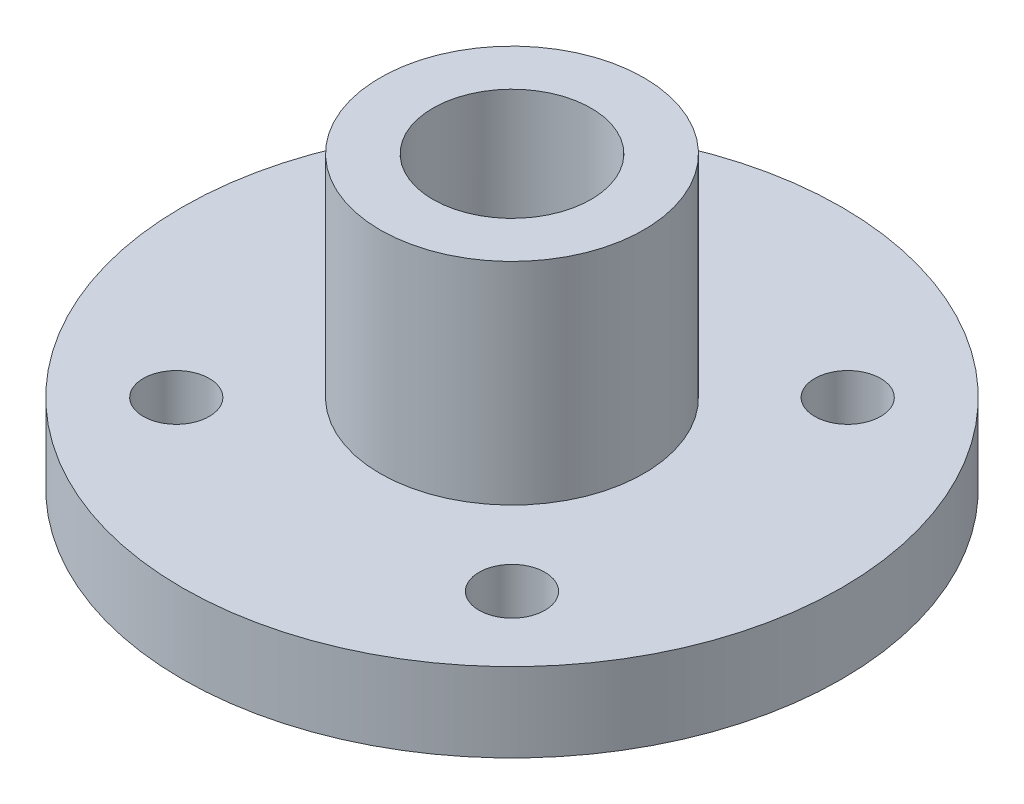
ISO-10303-21;
HEADER;
FILE_DESCRIPTION(('STEP AP214'),'2;1');
FILE_NAME('part.step','',(''),(''),'','','');
FILE_SCHEMA(('AUTOMOTIVE_DESIGN { 1 0 10303 214 1 1 1 1 }'));
ENDSEC;
DATA;
#1=APPLICATION_CONTEXT('core data for automotive mechanical design processes');
#2=APPLICATION_PROTOCOL_DEFINITION('international standard','automotive_design',2000,#1);
#3=PRODUCT_CONTEXT('',#1,'mechanical');
#4=PRODUCT('Part','Part','',(#3));
#5=PRODUCT_RELATED_PRODUCT_CATEGORY('part','',(#4));
#6=PRODUCT_DEFINITION_FORMATION('','',#4);
#7=PRODUCT_DEFINITION_CONTEXT('part definition',#1,'design');
#8=PRODUCT_DEFINITION('design','',#6,#7);
#9=PRODUCT_DEFINITION_SHAPE('','',#8);
#10=(LENGTH_UNIT() NAMED_UNIT(*) SI_UNIT(.MILLI.,.METRE.));
#11=(NAMED_UNIT(*) PLANE_ANGLE_UNIT() SI_UNIT($,.RADIAN.));
#12=(NAMED_UNIT(*) SI_UNIT($,.STERADIAN.) SOLID_ANGLE_UNIT());
#13=UNCERTAINTY_MEASURE_WITH_UNIT(LENGTH_MEASURE(1.E-05),#10,'distance_accuracy_value','');
#14=(GEOMETRIC_REPRESENTATION_CONTEXT(3) GLOBAL_UNCERTAINTY_ASSIGNED_CONTEXT((#13)) GLOBAL_UNIT_ASSIGNED_CONTEXT((#10,
#11,#12)) REPRESENTATION_CONTEXT('',''));
#15=CARTESIAN_POINT('',(0.,0.,0.));
#16=DIRECTION('',(0.,0.,1.));
#17=DIRECTION('',(1.,0.,0.));
#18=AXIS2_PLACEMENT_3D('',#15,#16,#17);
#19=CARTESIAN_POINT('',(-6.36396103067894,3.,-6.36396103067892));
#20=DIRECTION('',(0.,-1.,0.));
#21=DIRECTION('',(0.,0.,-1.));
#22=AXIS2_PLACEMENT_3D('',#19,#20,#21);
#23=CYLINDRICAL_SURFACE('',#22,1.25);
#24=CARTESIAN_POINT('',(-6.36396103067894,3.,-6.36396103067892));
#25=DIRECTION('',(0.,1.,0.));
#26=DIRECTION('',(0.,0.,1.));
#27=AXIS2_PLACEMENT_3D('',#24,#25,#26);
#28=CIRCLE('',#27,1.25);
#29=CARTESIAN_POINT('',(-6.36396103067894,3.,-5.11396103067892));
#30=VERTEX_POINT('',#29);
#31=EDGE_CURVE('E71',#30,#30,#28,.T.);
#32=ORIENTED_EDGE('',*,*,#31,.T.);
#33=EDGE_LOOP('',(#32));
#34=FACE_BOUND('',#33,.T.);
#35=CARTESIAN_POINT('',(-6.36396103067894,0.,-6.36396103067892));
#36=DIRECTION('',(0.,1.,0.));
#37=DIRECTION('',(0.,0.,1.));
#38=AXIS2_PLACEMENT_3D('',#35,#36,#37);
#39=CIRCLE('',#38,1.25);
#40=CARTESIAN_POINT('',(-6.36396103067894,0.,-5.11396103067892));
#41=VERTEX_POINT('',#40);
#42=EDGE_CURVE('E102',#41,#41,#39,.T.);
#43=ORIENTED_EDGE('',*,*,#42,.F.);
#44=EDGE_LOOP('',(#43));
#45=FACE_BOUND('',#44,.T.);
#46=ADVANCED_FACE('F51',(#34,#45),#23,.F.);
#47=CARTESIAN_POINT('',(6.36396103067894,3.,-6.36396103067891));
#48=DIRECTION('',(0.,-1.,0.));
#49=DIRECTION('',(0.,0.,-1.));
#50=AXIS2_PLACEMENT_3D('',#47,#48,#49);
#51=CYLINDRICAL_SURFACE('',#50,1.25);
#52=CARTESIAN_POINT('',(6.36396103067894,3.,-6.36396103067891));
#53=DIRECTION('',(0.,1.,0.));
#54=DIRECTION('',(0.,0.,1.));
#55=AXIS2_PLACEMENT_3D('',#52,#53,#54);
#56=CIRCLE('',#55,1.25);
#57=CARTESIAN_POINT('',(6.36396103067894,3.,-5.11396103067891));
#58=VERTEX_POINT('',#57);
#59=EDGE_CURVE('E87',#58,#58,#56,.T.);
#60=ORIENTED_EDGE('',*,*,#59,.T.);
#61=EDGE_LOOP('',(#60));
#62=FACE_BOUND('',#61,.T.);
#63=CARTESIAN_POINT('',(6.36396103067894,0.,-6.36396103067891));
#64=DIRECTION('',(0.,1.,0.));
#65=DIRECTION('',(0.,0.,1.));
#66=AXIS2_PLACEMENT_3D('',#63,#64,#65);
#67=CIRCLE('',#66,1.25);
#68=CARTESIAN_POINT('',(6.36396103067894,0.,-5.11396103067891));
#69=VERTEX_POINT('',#68);
#70=EDGE_CURVE('E103',#69,#69,#67,.T.);
#71=ORIENTED_EDGE('',*,*,#70,.F.);
#72=EDGE_LOOP('',(#71));
#73=FACE_BOUND('',#72,.T.);
#74=ADVANCED_FACE('F131',(#62,#73),#51,.F.);
#75=CARTESIAN_POINT('',(6.36396103067893,3.,6.36396103067897));
#76=DIRECTION('',(0.,-1.,0.));
#77=DIRECTION('',(0.,0.,-1.));
#78=AXIS2_PLACEMENT_3D('',#75,#76,#77);
#79=CYLINDRICAL_SURFACE('',#78,1.25);
#80=CARTESIAN_POINT('',(6.36396103067893,3.,6.36396103067897));
#81=DIRECTION('',(0.,1.,0.));
#82=DIRECTION('',(0.,0.,1.));
#83=AXIS2_PLACEMENT_3D('',#80,#81,#82);
#84=CIRCLE('',#83,1.25);
#85=CARTESIAN_POINT('',(6.36396103067893,3.,7.61396103067897));
#86=VERTEX_POINT('',#85);
#87=EDGE_CURVE('E84',#86,#86,#84,.T.);
#88=ORIENTED_EDGE('',*,*,#87,.T.);
#89=EDGE_LOOP('',(#88));
#90=FACE_BOUND('',#89,.T.);
#91=CARTESIAN_POINT('',(6.36396103067893,0.,6.36396103067897));
#92=DIRECTION('',(0.,1.,0.));
#93=DIRECTION('',(0.,0.,1.));
#94=AXIS2_PLACEMENT_3D('',#91,#92,#93);
#95=CIRCLE('',#94,1.25);
#96=CARTESIAN_POINT('',(6.36396103067893,0.,7.61396103067897));
#97=VERTEX_POINT('',#96);
#98=EDGE_CURVE('E97',#97,#97,#95,.T.);
#99=ORIENTED_EDGE('',*,*,#98,.F.);
#100=EDGE_LOOP('',(#99));
#101=FACE_BOUND('',#100,.T.);
#102=ADVANCED_FACE('F139',(#90,#101),#79,.F.);
#103=CARTESIAN_POINT('',(-6.36396103067894,3.,6.36396103067897));
#104=DIRECTION('',(0.,-1.,0.));
#105=DIRECTION('',(0.,0.,-1.));
#106=AXIS2_PLACEMENT_3D('',#103,#104,#105);
#107=CYLINDRICAL_SURFACE('',#106,1.25);
#108=CARTESIAN_POINT('',(-6.36396103067894,3.,6.36396103067897));
#109=DIRECTION('',(0.,1.,0.));
#110=DIRECTION('',(0.,0.,1.));
#111=AXIS2_PLACEMENT_3D('',#108,#109,#110);
#112=CIRCLE('',#111,1.25);
#113=CARTESIAN_POINT('',(-6.36396103067894,3.,7.61396103067897));
#114=VERTEX_POINT('',#113);
#115=EDGE_CURVE('E80',#114,#114,#112,.T.);
#116=ORIENTED_EDGE('',*,*,#115,.T.);
#117=EDGE_LOOP('',(#116));
#118=FACE_BOUND('',#117,.T.);
#119=CARTESIAN_POINT('',(-6.36396103067894,0.,6.36396103067897));
#120=DIRECTION('',(0.,1.,0.));
#121=DIRECTION('',(0.,0.,1.));
#122=AXIS2_PLACEMENT_3D('',#119,#120,#121);
#123=CIRCLE('',#122,1.25);
#124=CARTESIAN_POINT('',(-6.36396103067894,0.,7.61396103067897));
#125=VERTEX_POINT('',#124);
#126=EDGE_CURVE('E92',#125,#125,#123,.T.);
#127=ORIENTED_EDGE('',*,*,#126,.F.);
#128=EDGE_LOOP('',(#127));
#129=FACE_BOUND('',#128,.T.);
#130=ADVANCED_FACE('F52',(#118,#129),#107,.F.);
#131=CARTESIAN_POINT('',(0.,3.,0.));
#132=DIRECTION('',(0.,-1.,0.));
#133=DIRECTION('',(0.,0.,-1.));
#134=AXIS2_PLACEMENT_3D('',#131,#132,#133);
#135=CYLINDRICAL_SURFACE('',#134,12.5);
#136=CARTESIAN_POINT('',(0.,3.,0.));
#137=DIRECTION('',(0.,1.,0.));
#138=DIRECTION('',(0.,0.,1.));
#139=AXIS2_PLACEMENT_3D('',#136,#137,#138);
#140=CIRCLE('',#139,12.5);
#141=CARTESIAN_POINT('',(0.,3.,12.5));
#142=VERTEX_POINT('',#141);
#143=EDGE_CURVE('E62',#142,#142,#140,.T.);
#144=ORIENTED_EDGE('',*,*,#143,.F.);
#145=EDGE_LOOP('',(#144));
#146=FACE_BOUND('',#145,.T.);
#147=CARTESIAN_POINT('',(0.,0.,0.));
#148=DIRECTION('',(0.,1.,0.));
#149=DIRECTION('',(0.,0.,1.));
#150=AXIS2_PLACEMENT_3D('',#147,#148,#149);
#151=CIRCLE('',#150,12.5);
#152=CARTESIAN_POINT('',(0.,0.,12.5));
#153=VERTEX_POINT('',#152);
#154=EDGE_CURVE('E81',#153,#153,#151,.T.);
#155=ORIENTED_EDGE('',*,*,#154,.T.);
#156=EDGE_LOOP('',(#155));
#157=FACE_BOUND('',#156,.T.);
#158=ADVANCED_FACE('F115',(#146,#157),#135,.T.);
#159=CARTESIAN_POINT('',(0.,3.,0.));
#160=DIRECTION('',(0.,1.,0.));
#161=DIRECTION('',(0.,0.,1.));
#162=AXIS2_PLACEMENT_3D('',#159,#160,#161);
#163=PLANE('',#162);
#164=CARTESIAN_POINT('',(0.,3.,0.));
#165=DIRECTION('',(0.,1.,0.));
#166=DIRECTION('',(0.,0.,1.));
#167=AXIS2_PLACEMENT_3D('',#164,#165,#166);
#168=CIRCLE('',#167,5.);
#169=CARTESIAN_POINT('',(0.,3.,5.));
#170=VERTEX_POINT('',#169);
#171=EDGE_CURVE('E11',#170,#170,#168,.T.);
#172=ORIENTED_EDGE('',*,*,#171,.F.);
#173=EDGE_LOOP('',(#172));
#174=FACE_BOUND('',#173,.T.);
#175=ORIENTED_EDGE('',*,*,#115,.F.);
#176=EDGE_LOOP('',(#175));
#177=FACE_BOUND('',#176,.T.);
#178=ORIENTED_EDGE('',*,*,#87,.F.);
#179=EDGE_LOOP('',(#178));
#180=FACE_BOUND('',#179,.T.);
#181=ORIENTED_EDGE('',*,*,#59,.F.);
#182=EDGE_LOOP('',(#181));
#183=FACE_BOUND('',#182,.T.);
#184=ORIENTED_EDGE('',*,*,#31,.F.);
#185=EDGE_LOOP('',(#184));
#186=FACE_BOUND('',#185,.T.);
#187=ORIENTED_EDGE('',*,*,#143,.T.);
#188=EDGE_LOOP('',(#187));
#189=FACE_BOUND('',#188,.T.);
#190=ADVANCED_FACE('F120',(#174,#177,#180,#183,#186,#189),#163,.T.);
#191=CARTESIAN_POINT('',(0.,0.,0.));
#192=DIRECTION('',(0.,1.,0.));
#193=DIRECTION('',(0.,0.,1.));
#194=AXIS2_PLACEMENT_3D('',#191,#192,#193);
#195=PLANE('',#194);
#196=ORIENTED_EDGE('',*,*,#126,.T.);
#197=EDGE_LOOP('',(#196));
#198=FACE_BOUND('',#197,.T.);
#199=ORIENTED_EDGE('',*,*,#98,.T.);
#200=EDGE_LOOP('',(#199));
#201=FACE_BOUND('',#200,.T.);
#202=ORIENTED_EDGE('',*,*,#70,.T.);
#203=EDGE_LOOP('',(#202));
#204=FACE_BOUND('',#203,.T.);
#205=ORIENTED_EDGE('',*,*,#42,.T.);
#206=EDGE_LOOP('',(#205));
#207=FACE_BOUND('',#206,.T.);
#208=ORIENTED_EDGE('',*,*,#154,.F.);
#209=EDGE_LOOP('',(#208));
#210=FACE_BOUND('',#209,.T.);
#211=ADVANCED_FACE('F112',(#198,#201,#204,#207,#210),#195,.F.);
#212=CARTESIAN_POINT('',(0.,11.,0.));
#213=DIRECTION('',(0.,1.,0.));
#214=DIRECTION('',(0.,0.,1.));
#215=AXIS2_PLACEMENT_3D('',#212,#213,#214);
#216=PLANE('',#215);
#217=CARTESIAN_POINT('',(0.,11.,0.));
#218=DIRECTION('',(0.,1.,0.));
#219=DIRECTION('',(0.,0.,1.));
#220=AXIS2_PLACEMENT_3D('',#217,#218,#219);
#221=CIRCLE('',#220,5.);
#222=CARTESIAN_POINT('',(0.,11.,5.));
#223=VERTEX_POINT('',#222);
#224=EDGE_CURVE('E74',#223,#223,#221,.T.);
#225=ORIENTED_EDGE('',*,*,#224,.T.);
#226=EDGE_LOOP('',(#225));
#227=FACE_BOUND('',#226,.T.);
#228=CARTESIAN_POINT('',(0.,11.,0.));
#229=DIRECTION('',(0.,1.,0.));
#230=DIRECTION('',(0.,0.,1.));
#231=AXIS2_PLACEMENT_3D('',#228,#229,#230);
#232=CIRCLE('',#231,3.);
#233=CARTESIAN_POINT('',(0.,11.,3.));
#234=VERTEX_POINT('',#233);
#235=EDGE_CURVE('E253',#234,#234,#232,.T.);
#236=ORIENTED_EDGE('',*,*,#235,.F.);
#237=EDGE_LOOP('',(#236));
#238=FACE_BOUND('',#237,.T.);
#239=ADVANCED_FACE('F116',(#227,#238),#216,.T.);
#240=CARTESIAN_POINT('',(0.,11.,0.));
#241=DIRECTION('',(0.,-1.,0.));
#242=DIRECTION('',(0.,0.,-1.));
#243=AXIS2_PLACEMENT_3D('',#240,#241,#242);
#244=CYLINDRICAL_SURFACE('',#243,5.);
#245=CARTESIAN_POINT('',(-4.76969600708473,6.,-1.5));
#246=CARTESIAN_POINT('',(-4.7696968572698,6.0821945479424,-1.49999897633764));
#247=CARTESIAN_POINT('',(-4.77184390209069,6.16439922414402,-1.49322108167142));
#248=CARTESIAN_POINT('',(-4.780165783029,6.32640524959194,-1.46635844446749));
#249=CARTESIAN_POINT('',(-4.78634196493468,6.40620578650146,-1.44626925573578));
#250=CARTESIAN_POINT('',(-4.80196102485633,6.56103472827173,-1.39352753269955));
#251=CARTESIAN_POINT('',(-4.81139846703232,6.63607082963309,-1.36089589394243));
#252=CARTESIAN_POINT('',(-4.83246932547567,6.7796219339953,-1.28406421917929));
#253=CARTESIAN_POINT('',(-4.84410307041019,6.84813595868444,-1.23986245137053));
#254=CARTESIAN_POINT('',(-4.86866862185765,6.97886639057737,-1.13964754141627));
#255=CARTESIAN_POINT('',(-4.88162808311636,7.04084589794629,-1.08333207175807));
#256=CARTESIAN_POINT('',(-4.90714861936757,7.15463795132251,-0.961136237579599));
#257=CARTESIAN_POINT('',(-4.91970964297705,7.20644919044988,-0.895254645461111));
#258=CARTESIAN_POINT('',(-4.94333214579389,7.29946269983331,-0.75411143779369));
#259=CARTESIAN_POINT('',(-4.95435724342404,7.34042342444281,-0.678684021335814));
#260=CARTESIAN_POINT('',(-4.97334435920684,7.40898725904276,-0.521624645369353));
#261=CARTESIAN_POINT('',(-4.98130703789495,7.43659324985745,-0.439994028387911));
#262=CARTESIAN_POINT('',(-4.99307646003589,7.47688000109051,-0.275323852630829));
#263=CARTESIAN_POINT('',(-4.99699557369338,7.4899651276527,-0.1923913989538));
#264=CARTESIAN_POINT('',(-5.00063201501348,7.50211732464644,-0.0254218237493144));
#265=CARTESIAN_POINT('',(-5.00035022521079,7.50118733940196,0.0586150620503689));
#266=CARTESIAN_POINT('',(-4.99569603817659,7.48560713145698,0.222571156600161));
#267=CARTESIAN_POINT('',(-4.9914542020526,7.47139480619013,0.302536267641342));
#268=CARTESIAN_POINT('',(-4.97951522112593,7.43036866400571,0.458889213442527));
#269=CARTESIAN_POINT('',(-4.97181785750586,7.40355404905733,0.535276821322847));
#270=CARTESIAN_POINT('',(-4.95365220986963,7.33778797658144,0.683347326351281));
#271=CARTESIAN_POINT('',(-4.94315269676706,7.29869879719273,0.754965064694478));
#272=CARTESIAN_POINT('',(-4.92049640648069,7.20960214757177,0.890764673783156));
#273=CARTESIAN_POINT('',(-4.90833923637778,7.15959208703651,0.954944774872131));
#274=CARTESIAN_POINT('',(-4.88311550488165,7.0478022492484,1.0766604815298));
#275=CARTESIAN_POINT('',(-4.87003195321461,6.98564308097026,1.13384458040111));
#276=CARTESIAN_POINT('',(-4.84483979887497,6.85248998210995,1.23707651539824));
#277=CARTESIAN_POINT('',(-4.8327312931702,6.78149517461077,1.28312324482853));
#278=CARTESIAN_POINT('',(-4.81077903197678,6.63176053075101,1.3631399533545));
#279=CARTESIAN_POINT('',(-4.80095810695957,6.55295295413708,1.39698989237679));
#280=CARTESIAN_POINT('',(-4.78496392548436,6.39039279155446,1.45083362878413));
#281=CARTESIAN_POINT('',(-4.7787894791583,6.30664182846544,1.4708319464056));
#282=CARTESIAN_POINT('',(-4.77104849541241,6.13991763926072,1.49574770282165));
#283=CARTESIAN_POINT('',(-4.7693187867044,6.05703177610602,1.50119946380212));
#284=CARTESIAN_POINT('',(-4.77021192441924,5.89152709999013,1.49835947233062));
#285=CARTESIAN_POINT('',(-4.77283416156589,5.80890825126915,1.4900696437133));
#286=CARTESIAN_POINT('',(-4.78197558554912,5.64851162202913,1.4604576357419));
#287=CARTESIAN_POINT('',(-4.78839176507489,5.57066383573648,1.4394796143128));
#288=CARTESIAN_POINT('',(-4.80429141231227,5.41959830918508,1.3854857774794));
#289=CARTESIAN_POINT('',(-4.81377535359073,5.34638128585943,1.3524681034276));
#290=CARTESIAN_POINT('',(-4.83505835023047,5.20448253592787,1.274318711965));
#291=CARTESIAN_POINT('',(-4.84691271069799,5.13597527901421,1.22888564172729));
#292=CARTESIAN_POINT('',(-4.87148205646987,5.0073618938192,1.12755301600385));
#293=CARTESIAN_POINT('',(-4.88419724730003,4.94725778238721,1.07165095534897));
#294=CARTESIAN_POINT('',(-4.90963633548158,4.83481959418526,0.948455132493599));
#295=CARTESIAN_POINT('',(-4.92234245063004,4.78286437101302,0.880811065857434));
#296=CARTESIAN_POINT('',(-4.94584851748651,4.69103329897225,0.737461784590249));
#297=CARTESIAN_POINT('',(-4.95664856384717,4.65115685021854,0.661756970543944));
#298=CARTESIAN_POINT('',(-4.97505970474957,4.5849999694317,0.504935504705221));
#299=CARTESIAN_POINT('',(-4.98269453424966,4.55861798384102,0.423864622037839));
#300=CARTESIAN_POINT('',(-4.99401979596827,4.51993908110958,0.258169966504588));
#301=CARTESIAN_POINT('',(-4.9977113567088,4.50763813405158,0.173547217354763));
#302=CARTESIAN_POINT('',(-5.00066544081399,4.4977769559455,0.00665215388274276));
#303=CARTESIAN_POINT('',(-5.00009305111322,4.49966730459217,-0.0755851790862067));
#304=CARTESIAN_POINT('',(-4.99497264465037,4.51682163249912,-0.238519481164404));
#305=CARTESIAN_POINT('',(-4.99042485330463,4.53208485348044,-0.319216537346529));
#306=CARTESIAN_POINT('',(-4.97791168358327,4.57521166139962,-0.475935813041358));
#307=CARTESIAN_POINT('',(-4.96998352900866,4.60293818064901,-0.551998927351392));
#308=CARTESIAN_POINT('',(-4.9515294303945,4.67008191450719,-0.698433237752053));
#309=CARTESIAN_POINT('',(-4.94100305949946,4.70950105028619,-0.76880349605058));
#310=CARTESIAN_POINT('',(-4.91803965828228,4.80037345743003,-0.904301892420563));
#311=CARTESIAN_POINT('',(-4.90555226923559,4.85217143000077,-0.969190250076767));
#312=CARTESIAN_POINT('',(-4.88023537212334,4.9657103883328,-1.08953757134594));
#313=CARTESIAN_POINT('',(-4.86740576641079,5.02745423789815,-1.14499380960194));
#314=CARTESIAN_POINT('',(-4.84240680631319,5.16134077831051,-1.24656269394549));
#315=CARTESIAN_POINT('',(-4.83026852693485,5.23373855339044,-1.29234759757956));
#316=CARTESIAN_POINT('',(-4.80852547508793,5.38555517416102,-1.37104313528776));
#317=CARTESIAN_POINT('',(-4.79891948596955,5.4649706236012,-1.40395995557289));
#318=CARTESIAN_POINT('',(-4.78427816717595,5.61974043160627,-1.4530194253295));
#319=CARTESIAN_POINT('',(-4.7788615484052,5.69460864693099,-1.47058859011232));
#320=CARTESIAN_POINT('',(-4.77157042597167,5.84631522249577,-1.49407818835144));
#321=CARTESIAN_POINT('',(-4.7696952122143,5.92315318464525,-1.50000095706095));
#322=CARTESIAN_POINT('',(-4.76969600708473,6.,-1.5));
#323=B_SPLINE_CURVE_WITH_KNOTS('',3,(#245,#246,#247,#248,#249,#250,#251,#252,#253,#254,#255,
#256,#257,#258,#259,#260,#261,#262,#263,#264,#265,#266,#267,#268,#269,#270,#271,#272,#273,#274,
#275,#276,#277,#278,#279,#280,#281,#282,#283,#284,#285,#286,#287,#288,#289,#290,#291,#292,#293,
#294,#295,#296,#297,#298,#299,#300,#301,#302,#303,#304,#305,#306,#307,#308,#309,#310,#311,#312,
#313,#314,#315,#316,#317,#318,#319,#320,#321,#322),.UNSPECIFIED.,.T.,.F.,(4,2,2,2,2,2,2,2,2,2,2,
2,2,2,2,2,2,2,2,2,2,2,2,2,2,2,2,2,2,2,2,2,2,2,2,2,2,2,4),(0.,0.246300165915543,0.492682641689,
0.738656414466193,0.984667025370101,1.23773150007984,1.49082847871273,1.74915939273645,
2.00743455587877,2.25832140149558,2.5091555410144,2.7520012599088,2.99486235890376,
3.24055209335676,3.4863001659083,3.74152147023278,3.99676812491863,4.25446238246266,
4.51207250628411,4.76008080790309,5.00805439107388,5.24958594938817,5.49115481045787,
5.73920731809388,5.98731925928923,6.24479506100602,6.50225807324202,6.75775391814325,
7.01317662321682,7.2587630391122,7.50433553047755,7.74727096872219,7.99024634491378,
8.24099627054488,8.4918185262989,8.75011639669147,9.00828993963944,9.23861153857448,
9.4688869503356),.UNSPECIFIED.);
#324=CARTESIAN_POINT('',(-4.76969600708473,6.,-1.5));
#325=VERTEX_POINT('',#324);
#326=EDGE_CURVE('E250',#325,#325,#323,.T.);
#327=ORIENTED_EDGE('',*,*,#326,.T.);
#328=EDGE_LOOP('',(#327));
#329=FACE_BOUND('',#328,.T.);
#330=ORIENTED_EDGE('',*,*,#224,.F.);
#331=EDGE_LOOP('',(#330));
#332=FACE_BOUND('',#331,.T.);
#333=ORIENTED_EDGE('',*,*,#171,.T.);
#334=EDGE_LOOP('',(#333));
#335=FACE_BOUND('',#334,.T.);
#336=ADVANCED_FACE('F123',(#329,#332,#335),#244,.T.);
#337=CARTESIAN_POINT('',(0.,11.,0.));
#338=DIRECTION('',(0.,-1.,0.));
#339=DIRECTION('',(0.,0.,-1.));
#340=AXIS2_PLACEMENT_3D('',#337,#338,#339);
#341=CYLINDRICAL_SURFACE('',#340,3.);
#342=CARTESIAN_POINT('',(-2.59807621135332,6.,-1.5));
#343=CARTESIAN_POINT('',(-2.59808302092689,6.07816171229287,-1.4999945446118));
#344=CARTESIAN_POINT('',(-2.60165701781635,6.15642211728757,-1.49384995609983));
#345=CARTESIAN_POINT('',(-2.61543549678079,6.31054089701573,-1.46958481484708));
#346=CARTESIAN_POINT('',(-2.62565391083339,6.38639387256511,-1.45143909683127));
#347=CARTESIAN_POINT('',(-2.65124019908098,6.53317749651591,-1.40414992304972));
#348=CARTESIAN_POINT('',(-2.66658065209878,6.60413197871038,-1.3750649287406));
#349=CARTESIAN_POINT('',(-2.70063997225287,6.74013630299508,-1.30690128806456));
#350=CARTESIAN_POINT('',(-2.71935902214097,6.80518582539369,-1.26782210105366));
#351=CARTESIAN_POINT('',(-2.75995303586162,6.93345859283626,-1.17699981079632));
#352=CARTESIAN_POINT('',(-2.7819609545693,6.99608870351031,-1.12447805421566));
#353=CARTESIAN_POINT('',(-2.82557974178559,7.11211258261006,-1.0098807114217));
#354=CARTESIAN_POINT('',(-2.84719040746875,7.16550174387528,-0.94780038867344));
#355=CARTESIAN_POINT('',(-2.88932215429424,7.26505072672149,-0.81073434512182));
#356=CARTESIAN_POINT('',(-2.90967159627259,7.31048065178929,-0.735160783518863));
#357=CARTESIAN_POINT('',(-2.94526134149294,7.38771127986864,-0.576235539899256));
#358=CARTESIAN_POINT('',(-2.96050486775612,7.41952058420575,-0.492888807207233));
#359=CARTESIAN_POINT('',(-2.98320691866356,7.46625699195164,-0.327067415888966));
#360=CARTESIAN_POINT('',(-2.99114220331338,7.4822242895333,-0.244952685733226));
#361=CARTESIAN_POINT('',(-3.00011375769101,7.50024917801256,-0.078855943046772));
#362=CARTESIAN_POINT('',(-3.00115420176885,7.50231518519356,0.00512490876560788));
#363=CARTESIAN_POINT('',(-2.99644472874675,7.49287998904448,0.164748786635625));
#364=CARTESIAN_POINT('',(-2.99127743838241,7.48254297671817,0.240481798765187));
#365=CARTESIAN_POINT('',(-2.97561367889621,7.45067873414301,0.388970657877483));
#366=CARTESIAN_POINT('',(-2.96511681099591,7.42915066653566,0.461726281640888));
#367=CARTESIAN_POINT('',(-2.93957374931482,7.37537615086528,0.60346408735433));
#368=CARTESIAN_POINT('',(-2.92446662293799,7.3429855302419,0.672380135272767));
#369=CARTESIAN_POINT('',(-2.89106468980031,7.26860487569776,0.803965202269993));
#370=CARTESIAN_POINT('',(-2.87276874236226,7.22661140504647,0.866631973257968));
#371=CARTESIAN_POINT('',(-2.83266591598844,7.12965697270048,0.990260491347292));
#372=CARTESIAN_POINT('',(-2.81069063997263,7.07384545751098,1.05050111254404));
#373=CARTESIAN_POINT('',(-2.76681510880218,6.95311541260473,1.16115655544667));
#374=CARTESIAN_POINT('',(-2.74491492398443,6.88818994158891,1.21156381736135));
#375=CARTESIAN_POINT('',(-2.70216234138727,6.74602771136387,1.30425800196332));
#376=CARTESIAN_POINT('',(-2.68146479986061,6.66827096541868,1.34582597246708));
#377=CARTESIAN_POINT('',(-2.64563175417864,6.5055934929615,1.41497866950185));
#378=CARTESIAN_POINT('',(-2.63049045069101,6.42068035047366,1.44257798731633));
#379=CARTESIAN_POINT('',(-2.60916953725552,6.25317823307581,1.48077031653756));
#380=CARTESIAN_POINT('',(-2.60237483772745,6.17093832143467,1.49253768317996));
#381=CARTESIAN_POINT('',(-2.59676879042414,6.00539798772519,1.50227541991714));
#382=CARTESIAN_POINT('',(-2.59795180333967,5.92209835632032,1.50025553597254));
#383=CARTESIAN_POINT('',(-2.60751504810877,5.76651912213191,1.48355406501595));
#384=CARTESIAN_POINT('',(-2.61509381259981,5.69403082333811,1.4702817250687));
#385=CARTESIAN_POINT('',(-2.63541032327012,5.55244832059356,1.43354442694866));
#386=CARTESIAN_POINT('',(-2.64814974007551,5.48335522388009,1.41007616793542));
#387=CARTESIAN_POINT('',(-2.67804333119485,5.34688300364595,1.35247138290733));
#388=CARTESIAN_POINT('',(-2.69537464864595,5.27973147471967,1.31789109553908));
#389=CARTESIAN_POINT('',(-2.73234179245875,5.15179609269151,1.23943059602371));
#390=CARTESIAN_POINT('',(-2.75197880032721,5.09101553473007,1.19554560649832));
#391=CARTESIAN_POINT('',(-2.79431997684504,4.96953184871468,1.09325575079828));
#392=CARTESIAN_POINT('',(-2.81709874731434,4.90980427392351,1.03371790847245));
#393=CARTESIAN_POINT('',(-2.86101352466839,4.80088164300961,0.905106743097433));
#394=CARTESIAN_POINT('',(-2.88214897511564,4.75169014465419,0.836030211983021));
#395=CARTESIAN_POINT('',(-2.92112042536435,4.66413941107485,0.687803043838135));
#396=CARTESIAN_POINT('',(-2.93885462508044,4.62610032268363,0.608434646361169));
#397=CARTESIAN_POINT('',(-2.96825032438952,4.56429314421391,0.443283546961622));
#398=CARTESIAN_POINT('',(-2.9799171551456,4.54051252295054,0.357506552088263));
#399=CARTESIAN_POINT('',(-2.99501262272824,4.50994715373801,0.190469523495625));
#400=CARTESIAN_POINT('',(-2.99909891862287,4.50180318618583,0.109517165775685));
#401=CARTESIAN_POINT('',(-3.00063195562697,4.4987351018184,-0.0526889789268059));
#402=CARTESIAN_POINT('',(-2.99808102100335,4.50380635721465,-0.133942650442631));
#403=CARTESIAN_POINT('',(-2.98700953256884,4.52612461019343,-0.288806988475721));
#404=CARTESIAN_POINT('',(-2.97889342001985,4.54254727388651,-0.362568476716897));
#405=CARTESIAN_POINT('',(-2.95788140495135,4.58599049895445,-0.506168928275427));
#406=CARTESIAN_POINT('',(-2.94498481699194,4.61301258014018,-0.576007327433264));
#407=CARTESIAN_POINT('',(-2.9148889612218,4.67809057824896,-0.713135109367327));
#408=CARTESIAN_POINT('',(-2.89752925798199,4.71656898481176,-0.780187714050069));
#409=CARTESIAN_POINT('',(-2.86032199712739,4.80293689628858,-0.907161962721037));
#410=CARTESIAN_POINT('',(-2.84047329837541,4.85083072367351,-0.967080311122361));
#411=CARTESIAN_POINT('',(-2.79792915339941,4.96019570853405,-1.08437100623534));
#412=CARTESIAN_POINT('',(-2.77514698517547,5.02254373121579,-1.14089652680891));
#413=CARTESIAN_POINT('',(-2.73094614244278,5.15617608169465,-1.24299493109201));
#414=CARTESIAN_POINT('',(-2.70952868642798,5.22746823130153,-1.28855812501509));
#415=CARTESIAN_POINT('',(-2.66999407957374,5.37995496987143,-1.36864661967848));
#416=CARTESIAN_POINT('',(-2.65200261384405,5.46139129669311,-1.40277759894141));
#417=CARTESIAN_POINT('',(-2.62299234492527,5.62999860650967,-1.45631806425962));
#418=CARTESIAN_POINT('',(-2.61195024221553,5.71714933336903,-1.47577678676302));
#419=CARTESIAN_POINT('',(-2.60293908902686,5.83770803347799,-1.49155051179662));
#420=CARTESIAN_POINT('',(-2.60112193507728,5.87005184159682,-1.49471415744578));
#421=CARTESIAN_POINT('',(-2.59868903831625,5.93492472102336,-1.49894010763494));
#422=CARTESIAN_POINT('',(-2.59807337587664,5.96745380457881,-1.50000227159981));
#423=CARTESIAN_POINT('',(-2.59807621135332,6.,-1.5));
#424=B_SPLINE_CURVE_WITH_KNOTS('',3,(#342,#343,#344,#345,#346,#347,#348,#349,#350,#351,#352,
#353,#354,#355,#356,#357,#358,#359,#360,#361,#362,#363,#364,#365,#366,#367,#368,#369,#370,#371,
#372,#373,#374,#375,#376,#377,#378,#379,#380,#381,#382,#383,#384,#385,#386,#387,#388,#389,#390,
#391,#392,#393,#394,#395,#396,#397,#398,#399,#400,#401,#402,#403,#404,#405,#406,#407,#408,#409,
#410,#411,#412,#413,#414,#415,#416,#417,#418,#419,#420,#421,#422,#423),.UNSPECIFIED.,.T.,.F.,(4,
2,2,2,2,2,2,2,2,2,2,2,2,2,2,2,2,2,2,2,2,2,2,2,2,2,2,2,2,2,2,2,2,2,2,2,2,2,2,2,4),(0.,
0.234348183892072,0.469189339237207,0.702792893878329,0.936409088167725,1.18929346874735,
1.44230356626556,1.71236838358145,1.98226240445837,2.23295227451903,2.4834903552906,
2.71224146226808,2.94100968776183,3.1729430209672,3.40495949025408,3.65890787185336,
3.91305072368878,4.18333262594173,4.45333161317557,4.70193436281318,4.9503613978256,
5.17161275136038,5.39293578654095,5.62450944609131,5.85620229330071,6.1171011537092,
6.37808797467303,6.64596272119449,6.91360169713157,7.1566840558423,7.39968130190958,
7.62666637307239,7.8536840026802,8.09041126079208,8.32724745151079,8.58765362775101,
8.84828914267731,9.11716123557908,9.38512699504141,9.48270202777964,9.58028358741811),.UNSPECIFIED.);
#425=CARTESIAN_POINT('',(-2.59807621135332,6.,-1.5));
#426=VERTEX_POINT('',#425);
#427=EDGE_CURVE('E54',#426,#426,#424,.T.);
#428=ORIENTED_EDGE('',*,*,#427,.F.);
#429=EDGE_LOOP('',(#428));
#430=FACE_BOUND('',#429,.T.);
#431=ORIENTED_EDGE('',*,*,#235,.T.);
#432=EDGE_LOOP('',(#431));
#433=FACE_BOUND('',#432,.T.);
#434=CARTESIAN_POINT('',(0.,3.,0.));
#435=DIRECTION('',(0.,1.,0.));
#436=DIRECTION('',(0.,0.,1.));
#437=AXIS2_PLACEMENT_3D('',#434,#435,#436);
#438=CIRCLE('',#437,3.);
#439=CARTESIAN_POINT('',(0.,3.,3.));
#440=VERTEX_POINT('',#439);
#441=EDGE_CURVE('E251',#440,#440,#438,.T.);
#442=ORIENTED_EDGE('',*,*,#441,.F.);
#443=EDGE_LOOP('',(#442));
#444=FACE_BOUND('',#443,.T.);
#445=ADVANCED_FACE('F210',(#430,#433,#444),#341,.F.);
#446=ORIENTED_EDGE('',*,*,#441,.T.);
#447=EDGE_LOOP('',(#446));
#448=FACE_BOUND('',#447,.T.);
#449=ADVANCED_FACE('F127',(#448),#163,.T.);
#450=CARTESIAN_POINT('',(-12.5,6.,0.));
#451=DIRECTION('',(1.,0.,0.));
#452=DIRECTION('',(0.,0.,-1.));
#453=AXIS2_PLACEMENT_3D('',#450,#451,#452);
#454=CYLINDRICAL_SURFACE('',#453,1.5);
#455=ORIENTED_EDGE('',*,*,#427,.T.);
#456=EDGE_LOOP('',(#455));
#457=FACE_BOUND('',#456,.T.);
#458=ORIENTED_EDGE('',*,*,#326,.F.);
#459=EDGE_LOOP('',(#458));
#460=FACE_BOUND('',#459,.T.);
#461=ADVANCED_FACE('F207',(#457,#460),#454,.F.);
#462=CLOSED_SHELL('',(#46,#74,#102,#130,#158,#190,#211,#239,#336,#445,#449,#461));
#463=MANIFOLD_SOLID_BREP('B2',#462);
#464=ADVANCED_BREP_SHAPE_REPRESENTATION('',(#18,#463),#14);
#465=SHAPE_DEFINITION_REPRESENTATION(#9,#464);
ENDSEC;
END-ISO-10303-21;
